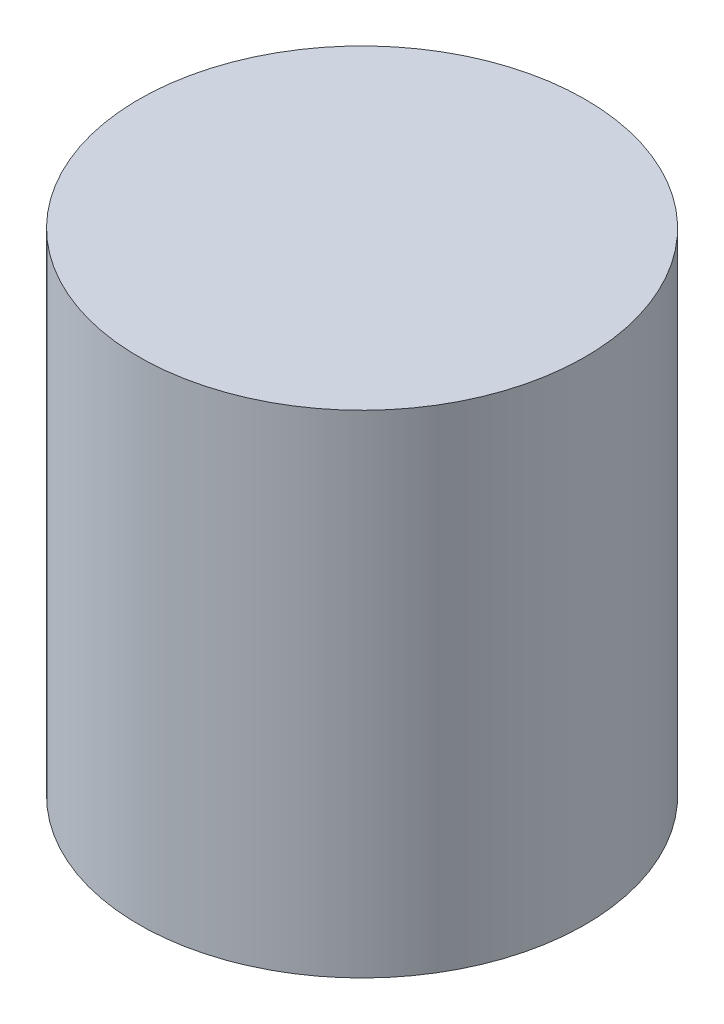
ISO-10303-21;
HEADER;
FILE_DESCRIPTION(('STEP AP214'),'2;1');
FILE_NAME('part.step','',(''),(''),'','','');
FILE_SCHEMA(('AUTOMOTIVE_DESIGN { 1 0 10303 214 1 1 1 1 }'));
ENDSEC;
DATA;
#1=APPLICATION_CONTEXT('core data for automotive mechanical design processes');
#2=APPLICATION_PROTOCOL_DEFINITION('international standard','automotive_design',2000,#1);
#3=PRODUCT_CONTEXT('',#1,'mechanical');
#4=PRODUCT('Part','Part','',(#3));
#5=PRODUCT_RELATED_PRODUCT_CATEGORY('part','',(#4));
#6=PRODUCT_DEFINITION_FORMATION('','',#4);
#7=PRODUCT_DEFINITION_CONTEXT('part definition',#1,'design');
#8=PRODUCT_DEFINITION('design','',#6,#7);
#9=PRODUCT_DEFINITION_SHAPE('','',#8);
#10=(LENGTH_UNIT() NAMED_UNIT(*) SI_UNIT(.MILLI.,.METRE.));
#11=(NAMED_UNIT(*) PLANE_ANGLE_UNIT() SI_UNIT($,.RADIAN.));
#12=(NAMED_UNIT(*) SI_UNIT($,.STERADIAN.) SOLID_ANGLE_UNIT());
#13=UNCERTAINTY_MEASURE_WITH_UNIT(LENGTH_MEASURE(1.E-05),#10,'distance_accuracy_value','');
#14=(GEOMETRIC_REPRESENTATION_CONTEXT(3) GLOBAL_UNCERTAINTY_ASSIGNED_CONTEXT((#13)) GLOBAL_UNIT_ASSIGNED_CONTEXT((#10,
#11,#12)) REPRESENTATION_CONTEXT('',''));
#15=CARTESIAN_POINT('',(0.,0.,0.));
#16=DIRECTION('',(0.,0.,1.));
#17=DIRECTION('',(1.,0.,0.));
#18=AXIS2_PLACEMENT_3D('',#15,#16,#17);
#19=CARTESIAN_POINT('',(-15.9458192845378,6.5,-10.6013413924675));
#20=DIRECTION('',(0.,-1.,0.));
#21=DIRECTION('',(0.,0.,-1.));
#22=AXIS2_PLACEMENT_3D('',#19,#20,#21);
#23=CYLINDRICAL_SURFACE('',#22,2.95);
#24=CARTESIAN_POINT('',(-15.9458192845378,6.5,-10.6013413924675));
#25=DIRECTION('',(0.,1.,0.));
#26=DIRECTION('',(0.,0.,1.));
#27=AXIS2_PLACEMENT_3D('',#24,#25,#26);
#28=CIRCLE('',#27,2.95);
#29=CARTESIAN_POINT('',(-15.9458192845378,6.5,-13.5513413924675));
#30=VERTEX_POINT('',#29);
#31=EDGE_CURVE('E10',#30,#30,#28,.T.);
#32=CARTESIAN_POINT('',(-15.9458192845378,0.,-10.6013413924675));
#33=DIRECTION('',(0.,1.,0.));
#34=DIRECTION('',(0.,0.,1.));
#35=AXIS2_PLACEMENT_3D('',#32,#33,#34);
#36=CIRCLE('',#35,2.95);
#37=CARTESIAN_POINT('',(-15.9458192845378,0.,-13.5513413924675));
#38=VERTEX_POINT('',#37);
#39=EDGE_CURVE('E40',#38,#38,#36,.T.);
#40=CARTESIAN_POINT('',(-15.9458192845378,6.5,-13.5513413924675));
#41=CARTESIAN_POINT('',(-15.9458192845378,6.43229166666667,-13.5513413924675));
#42=CARTESIAN_POINT('',(-15.9458192845378,6.36458333333333,-13.5513413924675));
#43=CARTESIAN_POINT('',(-15.9458192845378,6.22916666666667,-13.5513413924675));
#44=CARTESIAN_POINT('',(-15.9458192845378,6.16145833333333,-13.5513413924675));
#45=CARTESIAN_POINT('',(-15.9458192845378,6.02604166666667,-13.5513413924675));
#46=CARTESIAN_POINT('',(-15.9458192845378,5.95833333333333,-13.5513413924675));
#47=CARTESIAN_POINT('',(-15.9458192845378,5.82291666666667,-13.5513413924675));
#48=CARTESIAN_POINT('',(-15.9458192845378,5.75520833333333,-13.5513413924675));
#49=CARTESIAN_POINT('',(-15.9458192845378,5.61979166666667,-13.5513413924675));
#50=CARTESIAN_POINT('',(-15.9458192845378,5.55208333333333,-13.5513413924675));
#51=CARTESIAN_POINT('',(-15.9458192845378,5.41666666666667,-13.5513413924675));
#52=CARTESIAN_POINT('',(-15.9458192845378,5.34895833333333,-13.5513413924675));
#53=CARTESIAN_POINT('',(-15.9458192845378,5.21354166666667,-13.5513413924675));
#54=CARTESIAN_POINT('',(-15.9458192845378,5.14583333333333,-13.5513413924675));
#55=CARTESIAN_POINT('',(-15.9458192845378,5.01041666666667,-13.5513413924675));
#56=CARTESIAN_POINT('',(-15.9458192845378,4.94270833333333,-13.5513413924675));
#57=CARTESIAN_POINT('',(-15.9458192845378,4.80729166666667,-13.5513413924675));
#58=CARTESIAN_POINT('',(-15.9458192845378,4.73958333333333,-13.5513413924675));
#59=CARTESIAN_POINT('',(-15.9458192845378,4.60416666666667,-13.5513413924675));
#60=CARTESIAN_POINT('',(-15.9458192845378,4.53645833333333,-13.5513413924675));
#61=CARTESIAN_POINT('',(-15.9458192845378,4.40104166666667,-13.5513413924675));
#62=CARTESIAN_POINT('',(-15.9458192845378,4.33333333333333,-13.5513413924675));
#63=CARTESIAN_POINT('',(-15.9458192845378,4.19791666666667,-13.5513413924675));
#64=CARTESIAN_POINT('',(-15.9458192845378,4.13020833333333,-13.5513413924675));
#65=CARTESIAN_POINT('',(-15.9458192845378,3.99479166666667,-13.5513413924675));
#66=CARTESIAN_POINT('',(-15.9458192845378,3.92708333333333,-13.5513413924675));
#67=CARTESIAN_POINT('',(-15.9458192845378,3.79166666666667,-13.5513413924675));
#68=CARTESIAN_POINT('',(-15.9458192845378,3.72395833333333,-13.5513413924675));
#69=CARTESIAN_POINT('',(-15.9458192845378,3.58854166666667,-13.5513413924675));
#70=CARTESIAN_POINT('',(-15.9458192845378,3.52083333333333,-13.5513413924675));
#71=CARTESIAN_POINT('',(-15.9458192845378,3.38541666666667,-13.5513413924675));
#72=CARTESIAN_POINT('',(-15.9458192845378,3.31770833333333,-13.5513413924675));
#73=CARTESIAN_POINT('',(-15.9458192845378,3.18229166666667,-13.5513413924675));
#74=CARTESIAN_POINT('',(-15.9458192845378,3.11458333333333,-13.5513413924675));
#75=CARTESIAN_POINT('',(-15.9458192845378,2.97916666666667,-13.5513413924675));
#76=CARTESIAN_POINT('',(-15.9458192845378,2.91145833333333,-13.5513413924675));
#77=CARTESIAN_POINT('',(-15.9458192845378,2.77604166666667,-13.5513413924675));
#78=CARTESIAN_POINT('',(-15.9458192845378,2.70833333333333,-13.5513413924675));
#79=CARTESIAN_POINT('',(-15.9458192845378,2.57291666666667,-13.5513413924675));
#80=CARTESIAN_POINT('',(-15.9458192845378,2.50520833333333,-13.5513413924675));
#81=CARTESIAN_POINT('',(-15.9458192845378,2.36979166666667,-13.5513413924675));
#82=CARTESIAN_POINT('',(-15.9458192845378,2.30208333333333,-13.5513413924675));
#83=CARTESIAN_POINT('',(-15.9458192845378,2.16666666666667,-13.5513413924675));
#84=CARTESIAN_POINT('',(-15.9458192845378,2.09895833333333,-13.5513413924675));
#85=CARTESIAN_POINT('',(-15.9458192845378,1.96354166666667,-13.5513413924675));
#86=CARTESIAN_POINT('',(-15.9458192845378,1.89583333333333,-13.5513413924675));
#87=CARTESIAN_POINT('',(-15.9458192845378,1.76041666666667,-13.5513413924675));
#88=CARTESIAN_POINT('',(-15.9458192845378,1.69270833333333,-13.5513413924675));
#89=CARTESIAN_POINT('',(-15.9458192845378,1.55729166666667,-13.5513413924675));
#90=CARTESIAN_POINT('',(-15.9458192845378,1.48958333333333,-13.5513413924675));
#91=CARTESIAN_POINT('',(-15.9458192845378,1.35416666666667,-13.5513413924675));
#92=CARTESIAN_POINT('',(-15.9458192845378,1.28645833333333,-13.5513413924675));
#93=CARTESIAN_POINT('',(-15.9458192845378,1.15104166666667,-13.5513413924675));
#94=CARTESIAN_POINT('',(-15.9458192845378,1.08333333333333,-13.5513413924675));
#95=CARTESIAN_POINT('',(-15.9458192845378,0.947916666666667,-13.5513413924675));
#96=CARTESIAN_POINT('',(-15.9458192845378,0.880208333333333,-13.5513413924675));
#97=CARTESIAN_POINT('',(-15.9458192845378,0.744791666666667,-13.5513413924675));
#98=CARTESIAN_POINT('',(-15.9458192845378,0.677083333333333,-13.5513413924675));
#99=CARTESIAN_POINT('',(-15.9458192845378,0.541666666666667,-13.5513413924675));
#100=CARTESIAN_POINT('',(-15.9458192845378,0.473958333333333,-13.5513413924675));
#101=CARTESIAN_POINT('',(-15.9458192845378,0.338541666666667,-13.5513413924675));
#102=CARTESIAN_POINT('',(-15.9458192845378,0.270833333333334,-13.5513413924675));
#103=CARTESIAN_POINT('',(-15.9458192845378,0.135416666666667,-13.5513413924675));
#104=CARTESIAN_POINT('',(-15.9458192845378,0.0677083333333334,-13.5513413924675));
#105=CARTESIAN_POINT('',(-15.9458192845378,0.,-13.5513413924675));
#106=B_SPLINE_CURVE_WITH_KNOTS('',3,(#40,#41,#42,#43,#44,#45,#46,#47,#48,#49,#50,#51,#52,#53,
#54,#55,#56,#57,#58,#59,#60,#61,#62,#63,#64,#65,#66,#67,#68,#69,#70,#71,#72,#73,#74,#75,#76,#77,
#78,#79,#80,#81,#82,#83,#84,#85,#86,#87,#88,#89,#90,#91,#92,#93,#94,#95,#96,#97,#98,#99,#100,
#101,#102,#103,#104,#105),.UNSPECIFIED.,.F.,.F.,(4,2,2,2,2,2,2,2,2,2,2,2,2,2,2,2,2,2,2,2,2,2,2,
2,2,2,2,2,2,2,2,2,4),(0.,0.203125,0.40625,0.609375000000001,0.812500000000001,1.015625,1.21875,
1.421875,1.625,1.828125,2.03125,2.234375,2.4375,2.640625,2.84375,3.046875,3.25,3.453125,3.65625,
3.859375,4.0625,4.265625,4.46875,4.671875,4.875,5.078125,5.28125,5.484375,5.6875,5.890625,
6.09375,6.296875,6.5),.UNSPECIFIED.);
#107=EDGE_CURVE('BSEAM37',#30,#38,#106,.T.);
#108=ORIENTED_EDGE('',*,*,#31,.F.);
#109=ORIENTED_EDGE('',*,*,#39,.T.);
#110=ORIENTED_EDGE('',*,*,#107,.T.);
#111=ORIENTED_EDGE('',*,*,#107,.F.);
#112=EDGE_LOOP('',(#108,#110,#109,#111));
#113=FACE_BOUND('',#112,.T.);
#114=ADVANCED_FACE('F37',(#113),#23,.T.);
#115=CARTESIAN_POINT('',(-15.9458192845378,6.5,-10.6013413924675));
#116=DIRECTION('',(0.,1.,0.));
#117=DIRECTION('',(0.,0.,1.));
#118=AXIS2_PLACEMENT_3D('',#115,#116,#117);
#119=PLANE('',#118);
#120=ORIENTED_EDGE('',*,*,#31,.T.);
#121=EDGE_LOOP('',(#120));
#122=FACE_BOUND('',#121,.T.);
#123=ADVANCED_FACE('F54',(#122),#119,.T.);
#124=CARTESIAN_POINT('',(-15.9458192845378,0.,-10.6013413924675));
#125=DIRECTION('',(0.,1.,0.));
#126=DIRECTION('',(0.,0.,1.));
#127=AXIS2_PLACEMENT_3D('',#124,#125,#126);
#128=PLANE('',#127);
#129=ORIENTED_EDGE('',*,*,#39,.F.);
#130=EDGE_LOOP('',(#129));
#131=FACE_BOUND('',#130,.T.);
#132=ADVANCED_FACE('F52',(#131),#128,.F.);
#133=CLOSED_SHELL('',(#114,#123,#132));
#134=MANIFOLD_SOLID_BREP('B2',#133);
#135=ADVANCED_BREP_SHAPE_REPRESENTATION('',(#18,#134),#14);
#136=SHAPE_DEFINITION_REPRESENTATION(#9,#135);
ENDSEC;
END-ISO-10303-21;
